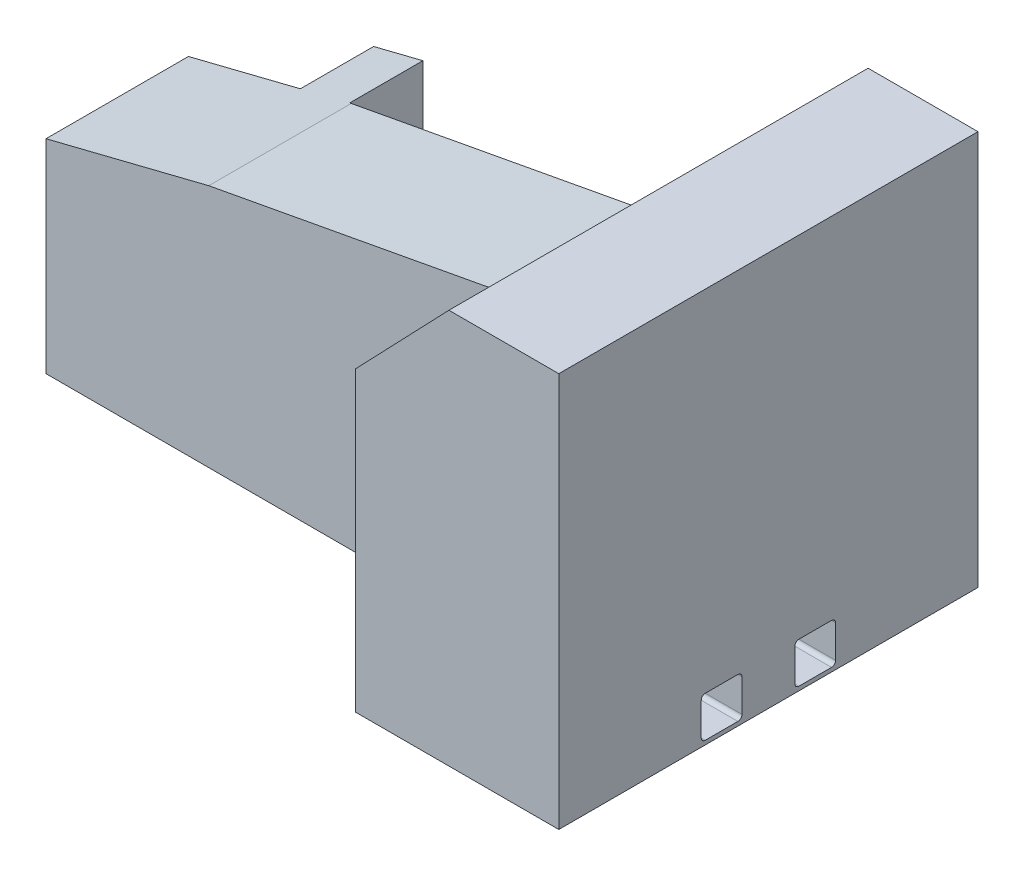
ISO-10303-21;
HEADER;
FILE_DESCRIPTION(('STEP AP214'),'2;1');
FILE_NAME('part.step','',(''),(''),'','','');
FILE_SCHEMA(('AUTOMOTIVE_DESIGN { 1 0 10303 214 1 1 1 1 }'));
ENDSEC;
DATA;
#1=APPLICATION_CONTEXT('core data for automotive mechanical design processes');
#2=APPLICATION_PROTOCOL_DEFINITION('international standard','automotive_design',2000,#1);
#3=PRODUCT_CONTEXT('',#1,'mechanical');
#4=PRODUCT('Part','Part','',(#3));
#5=PRODUCT_RELATED_PRODUCT_CATEGORY('part','',(#4));
#6=PRODUCT_DEFINITION_FORMATION('','',#4);
#7=PRODUCT_DEFINITION_CONTEXT('part definition',#1,'design');
#8=PRODUCT_DEFINITION('design','',#6,#7);
#9=PRODUCT_DEFINITION_SHAPE('','',#8);
#10=(LENGTH_UNIT() NAMED_UNIT(*) SI_UNIT(.MILLI.,.METRE.));
#11=(NAMED_UNIT(*) PLANE_ANGLE_UNIT() SI_UNIT($,.RADIAN.));
#12=(NAMED_UNIT(*) SI_UNIT($,.STERADIAN.) SOLID_ANGLE_UNIT());
#13=UNCERTAINTY_MEASURE_WITH_UNIT(LENGTH_MEASURE(1.E-05),#10,'distance_accuracy_value','');
#14=(GEOMETRIC_REPRESENTATION_CONTEXT(3) GLOBAL_UNCERTAINTY_ASSIGNED_CONTEXT((#13)) GLOBAL_UNIT_ASSIGNED_CONTEXT((#10,
#11,#12)) REPRESENTATION_CONTEXT('',''));
#15=CARTESIAN_POINT('',(0.,0.,0.));
#16=DIRECTION('',(0.,0.,1.));
#17=DIRECTION('',(1.,0.,0.));
#18=AXIS2_PLACEMENT_3D('',#15,#16,#17);
#19=CARTESIAN_POINT('',(-800.,970.,0.));
#20=DIRECTION('',(-1.,0.,0.));
#21=DIRECTION('',(0.,0.,1.));
#22=AXIS2_PLACEMENT_3D('',#19,#20,#21);
#23=PLANE('',#22);
#24=DIRECTION('',(0.,0.,1.));
#25=VECTOR('',#24,1.);
#26=CARTESIAN_POINT('',(-800.,500.,-515.));
#27=LINE('',#26,#25);
#28=CARTESIAN_POINT('',(-800.,500.,-175.));
#29=VERTEX_POINT('',#28);
#30=CARTESIAN_POINT('',(-800.,500.,175.));
#31=VERTEX_POINT('',#30);
#32=EDGE_CURVE('E336',#29,#31,#27,.T.);
#33=ORIENTED_EDGE('',*,*,#32,.F.);
#34=DIRECTION('',(0.,-1.,0.));
#35=VECTOR('',#34,1.);
#36=CARTESIAN_POINT('',(-800.,970.,-175.));
#37=LINE('',#36,#35);
#38=CARTESIAN_POINT('',(-800.,0.,-175.));
#39=VERTEX_POINT('',#38);
#40=EDGE_CURVE('E418',#29,#39,#37,.T.);
#41=ORIENTED_EDGE('',*,*,#40,.T.);
#42=DIRECTION('',(0.,0.,-1.));
#43=VECTOR('',#42,1.);
#44=CARTESIAN_POINT('',(-800.,0.,0.));
#45=LINE('',#44,#43);
#46=CARTESIAN_POINT('',(-800.,0.,175.));
#47=VERTEX_POINT('',#46);
#48=EDGE_CURVE('E395',#47,#39,#45,.T.);
#49=ORIENTED_EDGE('',*,*,#48,.F.);
#50=DIRECTION('',(0.,-1.,0.));
#51=VECTOR('',#50,1.);
#52=CARTESIAN_POINT('',(-800.,970.,175.));
#53=LINE('',#52,#51);
#54=EDGE_CURVE('E416',#31,#47,#53,.T.);
#55=ORIENTED_EDGE('',*,*,#54,.F.);
#56=EDGE_LOOP('',(#33,#41,#49,#55));
#57=FACE_BOUND('',#56,.T.);
#58=CARTESIAN_POINT('',(-800.,100.,75.));
#59=DIRECTION('',(-1.,0.,0.));
#60=DIRECTION('',(0.,0.,1.));
#61=AXIS2_PLACEMENT_3D('',#58,#59,#60);
#62=CIRCLE('',#61,9.99999999999999);
#63=CARTESIAN_POINT('',(-800.,110.,75.));
#64=VERTEX_POINT('',#63);
#65=CARTESIAN_POINT('',(-800.,99.9999999999999,65.));
#66=VERTEX_POINT('',#65);
#67=EDGE_CURVE('E295',#64,#66,#62,.T.);
#68=ORIENTED_EDGE('',*,*,#67,.F.);
#69=DIRECTION('',(0.,0.,1.));
#70=VECTOR('',#69,1.);
#71=CARTESIAN_POINT('',(-800.,110.,0.));
#72=LINE('',#71,#70);
#73=CARTESIAN_POINT('',(-800.,110.,155.));
#74=VERTEX_POINT('',#73);
#75=EDGE_CURVE('E68',#64,#74,#72,.T.);
#76=ORIENTED_EDGE('',*,*,#75,.T.);
#77=CARTESIAN_POINT('',(-800.,100.,155.));
#78=DIRECTION('',(-1.,0.,0.));
#79=DIRECTION('',(0.,0.,1.));
#80=AXIS2_PLACEMENT_3D('',#77,#78,#79);
#81=CIRCLE('',#80,10.);
#82=CARTESIAN_POINT('',(-800.,99.9999999999999,165.));
#83=VERTEX_POINT('',#82);
#84=EDGE_CURVE('E313',#74,#83,#81,.F.);
#85=ORIENTED_EDGE('',*,*,#84,.T.);
#86=DIRECTION('',(0.,-1.,0.));
#87=VECTOR('',#86,1.);
#88=CARTESIAN_POINT('',(-800.,0.,165.));
#89=LINE('',#88,#87);
#90=CARTESIAN_POINT('',(-800.,20.0000000000001,165.));
#91=VERTEX_POINT('',#90);
#92=EDGE_CURVE('E310',#83,#91,#89,.T.);
#93=ORIENTED_EDGE('',*,*,#92,.T.);
#94=CARTESIAN_POINT('',(-800.,20.,155.));
#95=DIRECTION('',(-1.,0.,0.));
#96=DIRECTION('',(0.,0.,1.));
#97=AXIS2_PLACEMENT_3D('',#94,#95,#96);
#98=CIRCLE('',#97,10.);
#99=CARTESIAN_POINT('',(-800.,10.,155.));
#100=VERTEX_POINT('',#99);
#101=EDGE_CURVE('E307',#100,#91,#98,.T.);
#102=ORIENTED_EDGE('',*,*,#101,.F.);
#103=DIRECTION('',(0.,0.,-1.));
#104=VECTOR('',#103,1.);
#105=CARTESIAN_POINT('',(-800.,10.,0.));
#106=LINE('',#105,#104);
#107=CARTESIAN_POINT('',(-800.,10.,75.));
#108=VERTEX_POINT('',#107);
#109=EDGE_CURVE('E304',#100,#108,#106,.T.);
#110=ORIENTED_EDGE('',*,*,#109,.T.);
#111=CARTESIAN_POINT('',(-800.,20.,75.));
#112=DIRECTION('',(-1.,0.,0.));
#113=DIRECTION('',(0.,0.,1.));
#114=AXIS2_PLACEMENT_3D('',#111,#112,#113);
#115=CIRCLE('',#114,10.);
#116=CARTESIAN_POINT('',(-800.,20.0000000000001,65.));
#117=VERTEX_POINT('',#116);
#118=EDGE_CURVE('E301',#117,#108,#115,.T.);
#119=ORIENTED_EDGE('',*,*,#118,.F.);
#120=DIRECTION('',(0.,1.,0.));
#121=VECTOR('',#120,1.);
#122=CARTESIAN_POINT('',(-800.,0.,65.));
#123=LINE('',#122,#121);
#124=EDGE_CURVE('E298',#117,#66,#123,.T.);
#125=ORIENTED_EDGE('',*,*,#124,.T.);
#126=EDGE_LOOP('',(#68,#76,#85,#93,#102,#110,#119,#125));
#127=FACE_BOUND('',#126,.T.);
#128=DIRECTION('',(0.,-1.,0.));
#129=VECTOR('',#128,1.);
#130=CARTESIAN_POINT('',(-800.,0.,-165.));
#131=LINE('',#130,#129);
#132=CARTESIAN_POINT('',(-800.,100.,-165.));
#133=VERTEX_POINT('',#132);
#134=CARTESIAN_POINT('',(-800.,20.0000000000001,-165.));
#135=VERTEX_POINT('',#134);
#136=EDGE_CURVE('E258',#133,#135,#131,.T.);
#137=ORIENTED_EDGE('',*,*,#136,.F.);
#138=CARTESIAN_POINT('',(-800.,100.,-155.));
#139=DIRECTION('',(-1.,0.,0.));
#140=DIRECTION('',(0.,0.,1.));
#141=AXIS2_PLACEMENT_3D('',#138,#139,#140);
#142=CIRCLE('',#141,10.);
#143=CARTESIAN_POINT('',(-800.,110.,-155.));
#144=VERTEX_POINT('',#143);
#145=EDGE_CURVE('E60',#133,#144,#142,.F.);
#146=ORIENTED_EDGE('',*,*,#145,.T.);
#147=DIRECTION('',(0.,0.,-1.));
#148=VECTOR('',#147,1.);
#149=CARTESIAN_POINT('',(-800.,110.,0.));
#150=LINE('',#149,#148);
#151=CARTESIAN_POINT('',(-800.,110.,-75.));
#152=VERTEX_POINT('',#151);
#153=EDGE_CURVE('E278',#152,#144,#150,.T.);
#154=ORIENTED_EDGE('',*,*,#153,.F.);
#155=CARTESIAN_POINT('',(-800.,100.,-75.));
#156=DIRECTION('',(-1.,0.,0.));
#157=DIRECTION('',(0.,0.,1.));
#158=AXIS2_PLACEMENT_3D('',#155,#156,#157);
#159=CIRCLE('',#158,9.99999999999999);
#160=CARTESIAN_POINT('',(-800.,99.9999999999999,-65.));
#161=VERTEX_POINT('',#160);
#162=EDGE_CURVE('E275',#161,#152,#159,.T.);
#163=ORIENTED_EDGE('',*,*,#162,.F.);
#164=DIRECTION('',(0.,1.,0.));
#165=VECTOR('',#164,1.);
#166=CARTESIAN_POINT('',(-800.,0.,-65.));
#167=LINE('',#166,#165);
#168=CARTESIAN_POINT('',(-800.,20.0000000000001,-65.));
#169=VERTEX_POINT('',#168);
#170=EDGE_CURVE('E272',#169,#161,#167,.T.);
#171=ORIENTED_EDGE('',*,*,#170,.F.);
#172=CARTESIAN_POINT('',(-800.,20.,-75.));
#173=DIRECTION('',(-1.,0.,0.));
#174=DIRECTION('',(0.,0.,1.));
#175=AXIS2_PLACEMENT_3D('',#172,#173,#174);
#176=CIRCLE('',#175,10.);
#177=CARTESIAN_POINT('',(-800.,10.,-75.));
#178=VERTEX_POINT('',#177);
#179=EDGE_CURVE('E266',#178,#169,#176,.T.);
#180=ORIENTED_EDGE('',*,*,#179,.F.);
#181=DIRECTION('',(0.,0.,1.));
#182=VECTOR('',#181,1.);
#183=CARTESIAN_POINT('',(-800.,10.,0.));
#184=LINE('',#183,#182);
#185=CARTESIAN_POINT('',(-800.,10.,-155.));
#186=VERTEX_POINT('',#185);
#187=EDGE_CURVE('E264',#186,#178,#184,.T.);
#188=ORIENTED_EDGE('',*,*,#187,.F.);
#189=CARTESIAN_POINT('',(-800.,20.,-155.));
#190=DIRECTION('',(-1.,0.,0.));
#191=DIRECTION('',(0.,0.,1.));
#192=AXIS2_PLACEMENT_3D('',#189,#190,#191);
#193=CIRCLE('',#192,10.);
#194=EDGE_CURVE('E248',#135,#186,#193,.T.);
#195=ORIENTED_EDGE('',*,*,#194,.F.);
#196=EDGE_LOOP('',(#137,#146,#154,#163,#171,#180,#188,#195));
#197=FACE_BOUND('',#196,.T.);
#198=ADVANCED_FACE('F43',(#57,#127,#197),#23,.T.);
#199=CARTESIAN_POINT('',(800.,970.,0.));
#200=DIRECTION('',(-1.,0.,0.));
#201=DIRECTION('',(0.,0.,1.));
#202=AXIS2_PLACEMENT_3D('',#199,#200,#201);
#203=PLANE('',#202);
#204=DIRECTION('',(0.,0.,1.));
#205=VECTOR('',#204,1.);
#206=CARTESIAN_POINT('',(800.,110.,0.));
#207=LINE('',#206,#205);
#208=CARTESIAN_POINT('',(800.,110.,75.));
#209=VERTEX_POINT('',#208);
#210=CARTESIAN_POINT('',(800.,110.,155.));
#211=VERTEX_POINT('',#210);
#212=EDGE_CURVE('E452',#209,#211,#207,.T.);
#213=ORIENTED_EDGE('',*,*,#212,.F.);
#214=CARTESIAN_POINT('',(800.,100.,75.));
#215=DIRECTION('',(-1.,0.,0.));
#216=DIRECTION('',(0.,0.,1.));
#217=AXIS2_PLACEMENT_3D('',#214,#215,#216);
#218=CIRCLE('',#217,9.99999999999999);
#219=CARTESIAN_POINT('',(800.,99.9999999999999,65.));
#220=VERTEX_POINT('',#219);
#221=EDGE_CURVE('E434',#209,#220,#218,.T.);
#222=ORIENTED_EDGE('',*,*,#221,.T.);
#223=DIRECTION('',(0.,1.,0.));
#224=VECTOR('',#223,1.);
#225=CARTESIAN_POINT('',(800.,970.,65.));
#226=LINE('',#225,#224);
#227=CARTESIAN_POINT('',(800.,20.0000000000001,65.));
#228=VERTEX_POINT('',#227);
#229=EDGE_CURVE('E437',#228,#220,#226,.T.);
#230=ORIENTED_EDGE('',*,*,#229,.F.);
#231=CARTESIAN_POINT('',(800.,20.,75.));
#232=DIRECTION('',(-1.,0.,0.));
#233=DIRECTION('',(0.,0.,1.));
#234=AXIS2_PLACEMENT_3D('',#231,#232,#233);
#235=CIRCLE('',#234,10.);
#236=CARTESIAN_POINT('',(800.,10.,75.));
#237=VERTEX_POINT('',#236);
#238=EDGE_CURVE('E440',#228,#237,#235,.T.);
#239=ORIENTED_EDGE('',*,*,#238,.T.);
#240=DIRECTION('',(0.,0.,-1.));
#241=VECTOR('',#240,1.);
#242=CARTESIAN_POINT('',(800.,10.,-2.28983498828939E-13));
#243=LINE('',#242,#241);
#244=CARTESIAN_POINT('',(800.,10.,155.));
#245=VERTEX_POINT('',#244);
#246=EDGE_CURVE('E443',#245,#237,#243,.T.);
#247=ORIENTED_EDGE('',*,*,#246,.F.);
#248=CARTESIAN_POINT('',(800.,20.,155.));
#249=DIRECTION('',(-1.,0.,0.));
#250=DIRECTION('',(0.,0.,1.));
#251=AXIS2_PLACEMENT_3D('',#248,#249,#250);
#252=CIRCLE('',#251,10.);
#253=CARTESIAN_POINT('',(800.,20.0000000000001,165.));
#254=VERTEX_POINT('',#253);
#255=EDGE_CURVE('E445',#245,#254,#252,.T.);
#256=ORIENTED_EDGE('',*,*,#255,.T.);
#257=DIRECTION('',(0.,-1.,0.));
#258=VECTOR('',#257,1.);
#259=CARTESIAN_POINT('',(800.,970.,165.));
#260=LINE('',#259,#258);
#261=CARTESIAN_POINT('',(800.,99.9999999999999,165.));
#262=VERTEX_POINT('',#261);
#263=EDGE_CURVE('E448',#262,#254,#260,.T.);
#264=ORIENTED_EDGE('',*,*,#263,.F.);
#265=CARTESIAN_POINT('',(800.,100.,155.));
#266=DIRECTION('',(-1.,0.,0.));
#267=DIRECTION('',(0.,0.,1.));
#268=AXIS2_PLACEMENT_3D('',#265,#266,#267);
#269=CIRCLE('',#268,10.);
#270=EDGE_CURVE('E450',#211,#262,#269,.F.);
#271=ORIENTED_EDGE('',*,*,#270,.F.);
#272=EDGE_LOOP('',(#213,#222,#230,#239,#247,#256,#264,#271));
#273=FACE_BOUND('',#272,.T.);
#274=DIRECTION('',(0.,0.,-1.));
#275=VECTOR('',#274,1.);
#276=CARTESIAN_POINT('',(800.,0.,0.));
#277=LINE('',#276,#275);
#278=CARTESIAN_POINT('',(800.,0.,515.));
#279=VERTEX_POINT('',#278);
#280=CARTESIAN_POINT('',(800.,0.,-515.));
#281=VERTEX_POINT('',#280);
#282=EDGE_CURVE('E370',#279,#281,#277,.T.);
#283=ORIENTED_EDGE('',*,*,#282,.T.);
#284=DIRECTION('',(0.,-1.,0.));
#285=VECTOR('',#284,1.);
#286=CARTESIAN_POINT('',(800.,970.,-515.));
#287=LINE('',#286,#285);
#288=CARTESIAN_POINT('',(800.,970.,-515.));
#289=VERTEX_POINT('',#288);
#290=EDGE_CURVE('E376',#289,#281,#287,.T.);
#291=ORIENTED_EDGE('',*,*,#290,.F.);
#292=DIRECTION('',(0.,0.,-1.));
#293=VECTOR('',#292,1.);
#294=CARTESIAN_POINT('',(800.,970.,0.));
#295=LINE('',#294,#293);
#296=CARTESIAN_POINT('',(800.,970.,515.));
#297=VERTEX_POINT('',#296);
#298=EDGE_CURVE('E373',#297,#289,#295,.T.);
#299=ORIENTED_EDGE('',*,*,#298,.F.);
#300=DIRECTION('',(0.,-1.,0.));
#301=VECTOR('',#300,1.);
#302=CARTESIAN_POINT('',(800.,970.,515.));
#303=LINE('',#302,#301);
#304=EDGE_CURVE('E410',#297,#279,#303,.T.);
#305=ORIENTED_EDGE('',*,*,#304,.T.);
#306=EDGE_LOOP('',(#283,#291,#299,#305));
#307=FACE_BOUND('',#306,.T.);
#308=CARTESIAN_POINT('',(800.,100.,-155.));
#309=DIRECTION('',(-1.,0.,0.));
#310=DIRECTION('',(0.,0.,1.));
#311=AXIS2_PLACEMENT_3D('',#308,#309,#310);
#312=CIRCLE('',#311,10.);
#313=CARTESIAN_POINT('',(800.,99.9999999999999,-165.));
#314=VERTEX_POINT('',#313);
#315=CARTESIAN_POINT('',(800.,110.,-155.));
#316=VERTEX_POINT('',#315);
#317=EDGE_CURVE('E11',#314,#316,#312,.F.);
#318=ORIENTED_EDGE('',*,*,#317,.F.);
#319=DIRECTION('',(0.,-1.,0.));
#320=VECTOR('',#319,1.);
#321=CARTESIAN_POINT('',(800.,970.,-165.));
#322=LINE('',#321,#320);
#323=CARTESIAN_POINT('',(800.,20.0000000000001,-165.));
#324=VERTEX_POINT('',#323);
#325=EDGE_CURVE('E454',#314,#324,#322,.T.);
#326=ORIENTED_EDGE('',*,*,#325,.T.);
#327=CARTESIAN_POINT('',(800.,20.,-155.));
#328=DIRECTION('',(-1.,0.,0.));
#329=DIRECTION('',(0.,0.,1.));
#330=AXIS2_PLACEMENT_3D('',#327,#328,#329);
#331=CIRCLE('',#330,10.);
#332=CARTESIAN_POINT('',(800.,10.,-155.));
#333=VERTEX_POINT('',#332);
#334=EDGE_CURVE('E251',#324,#333,#331,.T.);
#335=ORIENTED_EDGE('',*,*,#334,.T.);
#336=DIRECTION('',(0.,0.,1.));
#337=VECTOR('',#336,1.);
#338=CARTESIAN_POINT('',(800.,10.,2.28983498828939E-13));
#339=LINE('',#338,#337);
#340=CARTESIAN_POINT('',(800.,10.,-75.));
#341=VERTEX_POINT('',#340);
#342=EDGE_CURVE('E457',#333,#341,#339,.T.);
#343=ORIENTED_EDGE('',*,*,#342,.T.);
#344=CARTESIAN_POINT('',(800.,20.,-75.));
#345=DIRECTION('',(-1.,0.,0.));
#346=DIRECTION('',(0.,0.,1.));
#347=AXIS2_PLACEMENT_3D('',#344,#345,#346);
#348=CIRCLE('',#347,10.);
#349=CARTESIAN_POINT('',(800.,20.0000000000001,-65.));
#350=VERTEX_POINT('',#349);
#351=EDGE_CURVE('E460',#341,#350,#348,.T.);
#352=ORIENTED_EDGE('',*,*,#351,.T.);
#353=DIRECTION('',(0.,1.,0.));
#354=VECTOR('',#353,1.);
#355=CARTESIAN_POINT('',(800.,970.,-65.));
#356=LINE('',#355,#354);
#357=CARTESIAN_POINT('',(800.,99.9999999999999,-65.));
#358=VERTEX_POINT('',#357);
#359=EDGE_CURVE('E463',#350,#358,#356,.T.);
#360=ORIENTED_EDGE('',*,*,#359,.T.);
#361=CARTESIAN_POINT('',(800.,100.,-75.));
#362=DIRECTION('',(-1.,0.,0.));
#363=DIRECTION('',(0.,0.,1.));
#364=AXIS2_PLACEMENT_3D('',#361,#362,#363);
#365=CIRCLE('',#364,9.99999999999999);
#366=CARTESIAN_POINT('',(800.,110.,-75.));
#367=VERTEX_POINT('',#366);
#368=EDGE_CURVE('E466',#358,#367,#365,.T.);
#369=ORIENTED_EDGE('',*,*,#368,.T.);
#370=DIRECTION('',(0.,0.,-1.));
#371=VECTOR('',#370,1.);
#372=CARTESIAN_POINT('',(800.,110.,0.));
#373=LINE('',#372,#371);
#374=EDGE_CURVE('E52',#367,#316,#373,.T.);
#375=ORIENTED_EDGE('',*,*,#374,.T.);
#376=EDGE_LOOP('',(#318,#326,#335,#343,#352,#360,#369,#375));
#377=FACE_BOUND('',#376,.T.);
#378=ADVANCED_FACE('F504',(#273,#307,#377),#203,.F.);
#379=CARTESIAN_POINT('',(0.,970.,-515.));
#380=DIRECTION('',(0.,0.,-1.));
#381=DIRECTION('',(-1.,0.,0.));
#382=AXIS2_PLACEMENT_3D('',#379,#380,#381);
#383=PLANE('',#382);
#384=DIRECTION('',(0.691905363235615,0.721988205115424,0.));
#385=VECTOR('',#384,1.);
#386=CARTESIAN_POINT('',(-208.289592760181,199.610859728507,-515.));
#387=LINE('',#386,#385);
#388=CARTESIAN_POINT('',(300.,730.,-515.));
#389=VERTEX_POINT('',#388);
#390=CARTESIAN_POINT('',(530.,970.,-515.));
#391=VERTEX_POINT('',#390);
#392=EDGE_CURVE('E333',#389,#391,#387,.T.);
#393=ORIENTED_EDGE('',*,*,#392,.T.);
#394=DIRECTION('',(1.,0.,0.));
#395=VECTOR('',#394,1.);
#396=CARTESIAN_POINT('',(0.,970.,-515.));
#397=LINE('',#396,#395);
#398=EDGE_CURVE('E367',#391,#289,#397,.T.);
#399=ORIENTED_EDGE('',*,*,#398,.T.);
#400=ORIENTED_EDGE('',*,*,#290,.T.);
#401=DIRECTION('',(1.,0.,0.));
#402=VECTOR('',#401,1.);
#403=CARTESIAN_POINT('',(0.,0.,-515.));
#404=LINE('',#403,#402);
#405=CARTESIAN_POINT('',(300.,0.,-515.));
#406=VERTEX_POINT('',#405);
#407=EDGE_CURVE('E366',#406,#281,#404,.T.);
#408=ORIENTED_EDGE('',*,*,#407,.F.);
#409=DIRECTION('',(0.,-1.,0.));
#410=VECTOR('',#409,1.);
#411=CARTESIAN_POINT('',(300.,970.,-515.));
#412=LINE('',#411,#410);
#413=EDGE_CURVE('E430',#389,#406,#412,.T.);
#414=ORIENTED_EDGE('',*,*,#413,.F.);
#415=EDGE_LOOP('',(#393,#399,#400,#408,#414));
#416=FACE_BOUND('',#415,.T.);
#417=ADVANCED_FACE('F45',(#416),#383,.T.);
#418=CARTESIAN_POINT('',(300.,970.,0.));
#419=DIRECTION('',(-1.,0.,0.));
#420=DIRECTION('',(0.,0.,1.));
#421=AXIS2_PLACEMENT_3D('',#418,#419,#420);
#422=PLANE('',#421);
#423=DIRECTION('',(0.,0.,1.));
#424=VECTOR('',#423,1.);
#425=CARTESIAN_POINT('',(300.,730.,-515.));
#426=LINE('',#425,#424);
#427=CARTESIAN_POINT('',(300.,730.,-175.));
#428=VERTEX_POINT('',#427);
#429=EDGE_CURVE('E341',#389,#428,#426,.T.);
#430=ORIENTED_EDGE('',*,*,#429,.F.);
#431=ORIENTED_EDGE('',*,*,#413,.T.);
#432=DIRECTION('',(0.,0.,-1.));
#433=VECTOR('',#432,1.);
#434=CARTESIAN_POINT('',(300.,0.,0.));
#435=LINE('',#434,#433);
#436=CARTESIAN_POINT('',(300.,0.,-175.));
#437=VERTEX_POINT('',#436);
#438=EDGE_CURVE('E379',#437,#406,#435,.T.);
#439=ORIENTED_EDGE('',*,*,#438,.F.);
#440=DIRECTION('',(0.,-1.,0.));
#441=VECTOR('',#440,1.);
#442=CARTESIAN_POINT('',(300.,970.,-175.));
#443=LINE('',#442,#441);
#444=EDGE_CURVE('E428',#428,#437,#443,.T.);
#445=ORIENTED_EDGE('',*,*,#444,.F.);
#446=EDGE_LOOP('',(#430,#431,#439,#445));
#447=FACE_BOUND('',#446,.T.);
#448=ADVANCED_FACE('F567',(#447),#422,.T.);
#449=CARTESIAN_POINT('',(0.,970.,-175.));
#450=DIRECTION('',(0.,0.,-1.));
#451=DIRECTION('',(-1.,0.,0.));
#452=AXIS2_PLACEMENT_3D('',#449,#450,#451);
#453=PLANE('',#452);
#454=DIRECTION('',(-0.983188736076488,-0.182592193842776,0.));
#455=VECTOR('',#454,1.);
#456=CARTESIAN_POINT('',(53.0873939633064,684.144801736042,-175.));
#457=LINE('',#456,#455);
#458=CARTESIAN_POINT('',(-400.,600.,-175.));
#459=VERTEX_POINT('',#458);
#460=EDGE_CURVE('E351',#428,#459,#457,.T.);
#461=ORIENTED_EDGE('',*,*,#460,.F.);
#462=ORIENTED_EDGE('',*,*,#444,.T.);
#463=DIRECTION('',(1.,0.,0.));
#464=VECTOR('',#463,1.);
#465=CARTESIAN_POINT('',(0.,0.,-175.));
#466=LINE('',#465,#464);
#467=CARTESIAN_POINT('',(-404.,0.,-175.));
#468=VERTEX_POINT('',#467);
#469=EDGE_CURVE('E382',#468,#437,#466,.T.);
#470=ORIENTED_EDGE('',*,*,#469,.F.);
#471=DIRECTION('',(0.,-1.,0.));
#472=VECTOR('',#471,1.);
#473=CARTESIAN_POINT('',(-404.,970.,-175.));
#474=LINE('',#473,#472);
#475=CARTESIAN_POINT('',(-404.,599.,-175.));
#476=VERTEX_POINT('',#475);
#477=EDGE_CURVE('E426',#476,#468,#474,.T.);
#478=ORIENTED_EDGE('',*,*,#477,.F.);
#479=DIRECTION('',(-0.970142500145332,-0.242535625036333,0.));
#480=VECTOR('',#479,1.);
#481=CARTESIAN_POINT('',(63.5294117647059,715.882352941176,-175.));
#482=LINE('',#481,#480);
#483=EDGE_CURVE('E364',#459,#476,#482,.T.);
#484=ORIENTED_EDGE('',*,*,#483,.F.);
#485=EDGE_LOOP('',(#461,#462,#470,#478,#484));
#486=FACE_BOUND('',#485,.T.);
#487=ADVANCED_FACE('F556',(#486),#453,.T.);
#488=CARTESIAN_POINT('',(-404.,970.,0.));
#489=DIRECTION('',(-1.,0.,0.));
#490=DIRECTION('',(0.,0.,1.));
#491=AXIS2_PLACEMENT_3D('',#488,#489,#490);
#492=PLANE('',#491);
#493=DIRECTION('',(0.,-1.,0.));
#494=VECTOR('',#493,1.);
#495=CARTESIAN_POINT('',(-404.,970.,-355.));
#496=LINE('',#495,#494);
#497=CARTESIAN_POINT('',(-404.,599.,-355.));
#498=VERTEX_POINT('',#497);
#499=CARTESIAN_POINT('',(-404.,0.,-355.));
#500=VERTEX_POINT('',#499);
#501=EDGE_CURVE('E424',#498,#500,#496,.T.);
#502=ORIENTED_EDGE('',*,*,#501,.F.);
#503=DIRECTION('',(0.,0.,1.));
#504=VECTOR('',#503,1.);
#505=CARTESIAN_POINT('',(-404.,599.,0.));
#506=LINE('',#505,#504);
#507=EDGE_CURVE('E361',#498,#476,#506,.T.);
#508=ORIENTED_EDGE('',*,*,#507,.T.);
#509=ORIENTED_EDGE('',*,*,#477,.T.);
#510=DIRECTION('',(0.,0.,-1.));
#511=VECTOR('',#510,1.);
#512=CARTESIAN_POINT('',(-404.,0.,0.));
#513=LINE('',#512,#511);
#514=EDGE_CURVE('E385',#468,#500,#513,.T.);
#515=ORIENTED_EDGE('',*,*,#514,.T.);
#516=EDGE_LOOP('',(#502,#508,#509,#515));
#517=FACE_BOUND('',#516,.T.);
#518=ADVANCED_FACE('F563',(#517),#492,.F.);
#519=CARTESIAN_POINT('',(0.,970.,-355.));
#520=DIRECTION('',(0.,0.,1.));
#521=DIRECTION('',(1.,0.,0.));
#522=AXIS2_PLACEMENT_3D('',#519,#520,#521);
#523=PLANE('',#522);
#524=DIRECTION('',(0.,-1.,0.));
#525=VECTOR('',#524,1.);
#526=CARTESIAN_POINT('',(-525.,970.,-355.));
#527=LINE('',#526,#525);
#528=CARTESIAN_POINT('',(-525.,568.75,-355.));
#529=VERTEX_POINT('',#528);
#530=CARTESIAN_POINT('',(-525.,0.,-355.));
#531=VERTEX_POINT('',#530);
#532=EDGE_CURVE('E422',#529,#531,#527,.T.);
#533=ORIENTED_EDGE('',*,*,#532,.F.);
#534=DIRECTION('',(0.970142500145332,0.242535625036333,0.));
#535=VECTOR('',#534,1.);
#536=CARTESIAN_POINT('',(63.5294117647059,715.882352941176,-355.));
#537=LINE('',#536,#535);
#538=EDGE_CURVE('E358',#529,#498,#537,.T.);
#539=ORIENTED_EDGE('',*,*,#538,.T.);
#540=ORIENTED_EDGE('',*,*,#501,.T.);
#541=DIRECTION('',(-1.,0.,0.));
#542=VECTOR('',#541,1.);
#543=CARTESIAN_POINT('',(0.,0.,-355.));
#544=LINE('',#543,#542);
#545=EDGE_CURVE('E389',#500,#531,#544,.T.);
#546=ORIENTED_EDGE('',*,*,#545,.T.);
#547=EDGE_LOOP('',(#533,#539,#540,#546));
#548=FACE_BOUND('',#547,.T.);
#549=ADVANCED_FACE('F559',(#548),#523,.F.);
#550=CARTESIAN_POINT('',(-525.,970.,0.));
#551=DIRECTION('',(1.,0.,0.));
#552=DIRECTION('',(0.,0.,-1.));
#553=AXIS2_PLACEMENT_3D('',#550,#551,#552);
#554=PLANE('',#553);
#555=DIRECTION('',(0.,-1.,0.));
#556=VECTOR('',#555,1.);
#557=CARTESIAN_POINT('',(-525.,970.,-175.));
#558=LINE('',#557,#556);
#559=CARTESIAN_POINT('',(-525.,568.75,-175.));
#560=VERTEX_POINT('',#559);
#561=CARTESIAN_POINT('',(-525.,0.,-175.));
#562=VERTEX_POINT('',#561);
#563=EDGE_CURVE('E420',#560,#562,#558,.T.);
#564=ORIENTED_EDGE('',*,*,#563,.F.);
#565=DIRECTION('',(0.,0.,-1.));
#566=VECTOR('',#565,1.);
#567=CARTESIAN_POINT('',(-525.,568.75,0.));
#568=LINE('',#567,#566);
#569=EDGE_CURVE('E355',#560,#529,#568,.T.);
#570=ORIENTED_EDGE('',*,*,#569,.T.);
#571=ORIENTED_EDGE('',*,*,#532,.T.);
#572=DIRECTION('',(0.,0.,1.));
#573=VECTOR('',#572,1.);
#574=CARTESIAN_POINT('',(-525.,0.,0.));
#575=LINE('',#574,#573);
#576=EDGE_CURVE('E392',#531,#562,#575,.T.);
#577=ORIENTED_EDGE('',*,*,#576,.T.);
#578=EDGE_LOOP('',(#564,#570,#571,#577));
#579=FACE_BOUND('',#578,.T.);
#580=ADVANCED_FACE('F554',(#579),#554,.F.);
#581=DIRECTION('',(-0.970142500145332,-0.242535625036333,0.));
#582=VECTOR('',#581,1.);
#583=CARTESIAN_POINT('',(63.5294117647059,715.882352941176,-175.));
#584=LINE('',#583,#582);
#585=EDGE_CURVE('E353',#560,#29,#584,.T.);
#586=ORIENTED_EDGE('',*,*,#585,.F.);
#587=ORIENTED_EDGE('',*,*,#563,.T.);
#588=EDGE_CURVE('E386',#39,#562,#466,.T.);
#589=ORIENTED_EDGE('',*,*,#588,.F.);
#590=ORIENTED_EDGE('',*,*,#40,.F.);
#591=EDGE_LOOP('',(#586,#587,#589,#590));
#592=FACE_BOUND('',#591,.T.);
#593=ADVANCED_FACE('F551',(#592),#453,.T.);
#594=CARTESIAN_POINT('',(0.,970.,175.));
#595=DIRECTION('',(0.,0.,1.));
#596=DIRECTION('',(1.,0.,0.));
#597=AXIS2_PLACEMENT_3D('',#594,#595,#596);
#598=PLANE('',#597);
#599=DIRECTION('',(0.983188736076488,0.182592193842776,0.));
#600=VECTOR('',#599,1.);
#601=CARTESIAN_POINT('',(53.0873939633064,684.144801736042,175.));
#602=LINE('',#601,#600);
#603=CARTESIAN_POINT('',(-400.,600.,175.));
#604=VERTEX_POINT('',#603);
#605=CARTESIAN_POINT('',(300.,730.,175.));
#606=VERTEX_POINT('',#605);
#607=EDGE_CURVE('E340',#604,#606,#602,.T.);
#608=ORIENTED_EDGE('',*,*,#607,.F.);
#609=DIRECTION('',(0.970142500145332,0.242535625036333,0.));
#610=VECTOR('',#609,1.);
#611=CARTESIAN_POINT('',(63.5294117647059,715.882352941176,175.));
#612=LINE('',#611,#610);
#613=EDGE_CURVE('E432',#31,#604,#612,.T.);
#614=ORIENTED_EDGE('',*,*,#613,.F.);
#615=ORIENTED_EDGE('',*,*,#54,.T.);
#616=DIRECTION('',(-1.,0.,0.));
#617=VECTOR('',#616,1.);
#618=CARTESIAN_POINT('',(0.,0.,175.));
#619=LINE('',#618,#617);
#620=CARTESIAN_POINT('',(300.,0.,175.));
#621=VERTEX_POINT('',#620);
#622=EDGE_CURVE('E398',#621,#47,#619,.T.);
#623=ORIENTED_EDGE('',*,*,#622,.F.);
#624=DIRECTION('',(0.,-1.,0.));
#625=VECTOR('',#624,1.);
#626=CARTESIAN_POINT('',(300.,970.,175.));
#627=LINE('',#626,#625);
#628=EDGE_CURVE('E414',#606,#621,#627,.T.);
#629=ORIENTED_EDGE('',*,*,#628,.F.);
#630=EDGE_LOOP('',(#608,#614,#615,#623,#629));
#631=FACE_BOUND('',#630,.T.);
#632=ADVANCED_FACE('F549',(#631),#598,.T.);
#633=CARTESIAN_POINT('',(300.,970.,0.));
#634=DIRECTION('',(-1.,0.,0.));
#635=DIRECTION('',(0.,0.,1.));
#636=AXIS2_PLACEMENT_3D('',#633,#634,#635);
#637=PLANE('',#636);
#638=CARTESIAN_POINT('',(300.,730.,515.));
#639=VERTEX_POINT('',#638);
#640=EDGE_CURVE('E345',#606,#639,#426,.T.);
#641=ORIENTED_EDGE('',*,*,#640,.F.);
#642=ORIENTED_EDGE('',*,*,#628,.T.);
#643=DIRECTION('',(0.,0.,-1.));
#644=VECTOR('',#643,1.);
#645=CARTESIAN_POINT('',(300.,0.,0.));
#646=LINE('',#645,#644);
#647=CARTESIAN_POINT('',(300.,0.,515.));
#648=VERTEX_POINT('',#647);
#649=EDGE_CURVE('E401',#648,#621,#646,.T.);
#650=ORIENTED_EDGE('',*,*,#649,.F.);
#651=DIRECTION('',(0.,-1.,0.));
#652=VECTOR('',#651,1.);
#653=CARTESIAN_POINT('',(300.,970.,515.));
#654=LINE('',#653,#652);
#655=EDGE_CURVE('E412',#639,#648,#654,.T.);
#656=ORIENTED_EDGE('',*,*,#655,.F.);
#657=EDGE_LOOP('',(#641,#642,#650,#656));
#658=FACE_BOUND('',#657,.T.);
#659=ADVANCED_FACE('F612',(#658),#637,.T.);
#660=CARTESIAN_POINT('',(1.14352971536391E-13,970.,515.));
#661=DIRECTION('',(0.,0.,1.));
#662=DIRECTION('',(1.,0.,0.));
#663=AXIS2_PLACEMENT_3D('',#660,#661,#662);
#664=PLANE('',#663);
#665=DIRECTION('',(0.691905363235615,0.721988205115424,0.));
#666=VECTOR('',#665,1.);
#667=CARTESIAN_POINT('',(-208.289592760181,199.610859728507,515.));
#668=LINE('',#667,#666);
#669=CARTESIAN_POINT('',(530.,970.,515.));
#670=VERTEX_POINT('',#669);
#671=EDGE_CURVE('E283',#639,#670,#668,.T.);
#672=ORIENTED_EDGE('',*,*,#671,.F.);
#673=ORIENTED_EDGE('',*,*,#655,.T.);
#674=DIRECTION('',(-1.,0.,0.));
#675=VECTOR('',#674,1.);
#676=CARTESIAN_POINT('',(1.14352971536391E-13,0.,515.));
#677=LINE('',#676,#675);
#678=EDGE_CURVE('E404',#279,#648,#677,.T.);
#679=ORIENTED_EDGE('',*,*,#678,.F.);
#680=ORIENTED_EDGE('',*,*,#304,.F.);
#681=DIRECTION('',(-1.,0.,0.));
#682=VECTOR('',#681,1.);
#683=CARTESIAN_POINT('',(1.14352971536391E-13,970.,515.));
#684=LINE('',#683,#682);
#685=EDGE_CURVE('E369',#297,#670,#684,.T.);
#686=ORIENTED_EDGE('',*,*,#685,.T.);
#687=EDGE_LOOP('',(#672,#673,#679,#680,#686));
#688=FACE_BOUND('',#687,.T.);
#689=ADVANCED_FACE('F629',(#688),#664,.T.);
#690=CARTESIAN_POINT('',(0.,970.,0.));
#691=DIRECTION('',(0.,1.,0.));
#692=DIRECTION('',(0.,0.,1.));
#693=AXIS2_PLACEMENT_3D('',#690,#691,#692);
#694=PLANE('',#693);
#695=DIRECTION('',(0.,0.,1.));
#696=VECTOR('',#695,1.);
#697=CARTESIAN_POINT('',(530.,970.,-515.));
#698=LINE('',#697,#696);
#699=EDGE_CURVE('E337',#391,#670,#698,.T.);
#700=ORIENTED_EDGE('',*,*,#699,.T.);
#701=ORIENTED_EDGE('',*,*,#685,.F.);
#702=ORIENTED_EDGE('',*,*,#298,.T.);
#703=ORIENTED_EDGE('',*,*,#398,.F.);
#704=EDGE_LOOP('',(#700,#701,#702,#703));
#705=FACE_BOUND('',#704,.T.);
#706=ADVANCED_FACE('F624',(#705),#694,.T.);
#707=CARTESIAN_POINT('',(0.,0.,0.));
#708=DIRECTION('',(0.,1.,0.));
#709=DIRECTION('',(0.,0.,1.));
#710=AXIS2_PLACEMENT_3D('',#707,#708,#709);
#711=PLANE('',#710);
#712=CARTESIAN_POINT('',(498.5,0.,115.));
#713=DIRECTION('',(0.,-1.,0.));
#714=DIRECTION('',(0.,0.,1.));
#715=AXIS2_PLACEMENT_3D('',#712,#713,#714);
#716=CIRCLE('',#715,8.4999999999999);
#717=CARTESIAN_POINT('',(498.5,0.,123.5));
#718=VERTEX_POINT('',#717);
#719=EDGE_CURVE('E904',#718,#718,#716,.T.);
#720=ORIENTED_EDGE('',*,*,#719,.F.);
#721=EDGE_LOOP('',(#720));
#722=FACE_BOUND('',#721,.T.);
#723=CARTESIAN_POINT('',(501.,0.,-115.));
#724=DIRECTION('',(0.,-1.,0.));
#725=DIRECTION('',(0.,0.,1.));
#726=AXIS2_PLACEMENT_3D('',#723,#724,#725);
#727=CIRCLE('',#726,8.50000000000001);
#728=CARTESIAN_POINT('',(501.,0.,-106.5));
#729=VERTEX_POINT('',#728);
#730=EDGE_CURVE('E901',#729,#729,#727,.T.);
#731=ORIENTED_EDGE('',*,*,#730,.F.);
#732=EDGE_LOOP('',(#731));
#733=FACE_BOUND('',#732,.T.);
#734=CARTESIAN_POINT('',(-501.,0.,-115.));
#735=DIRECTION('',(0.,-1.,0.));
#736=DIRECTION('',(0.,0.,-1.));
#737=AXIS2_PLACEMENT_3D('',#734,#735,#736);
#738=CIRCLE('',#737,8.50000000000001);
#739=CARTESIAN_POINT('',(-501.,0.,-123.5));
#740=VERTEX_POINT('',#739);
#741=EDGE_CURVE('E898',#740,#740,#738,.T.);
#742=ORIENTED_EDGE('',*,*,#741,.F.);
#743=EDGE_LOOP('',(#742));
#744=FACE_BOUND('',#743,.T.);
#745=CARTESIAN_POINT('',(-498.5,0.,115.));
#746=DIRECTION('',(0.,-1.,0.));
#747=DIRECTION('',(0.,0.,-1.));
#748=AXIS2_PLACEMENT_3D('',#745,#746,#747);
#749=CIRCLE('',#748,8.4999999999999);
#750=CARTESIAN_POINT('',(-498.5,0.,106.5));
#751=VERTEX_POINT('',#750);
#752=EDGE_CURVE('E475',#751,#751,#749,.T.);
#753=ORIENTED_EDGE('',*,*,#752,.F.);
#754=EDGE_LOOP('',(#753));
#755=FACE_BOUND('',#754,.T.);
#756=ORIENTED_EDGE('',*,*,#407,.T.);
#757=ORIENTED_EDGE('',*,*,#282,.F.);
#758=ORIENTED_EDGE('',*,*,#678,.T.);
#759=ORIENTED_EDGE('',*,*,#649,.T.);
#760=ORIENTED_EDGE('',*,*,#622,.T.);
#761=ORIENTED_EDGE('',*,*,#48,.T.);
#762=ORIENTED_EDGE('',*,*,#588,.T.);
#763=ORIENTED_EDGE('',*,*,#576,.F.);
#764=ORIENTED_EDGE('',*,*,#545,.F.);
#765=ORIENTED_EDGE('',*,*,#514,.F.);
#766=ORIENTED_EDGE('',*,*,#469,.T.);
#767=ORIENTED_EDGE('',*,*,#438,.T.);
#768=EDGE_LOOP('',(#756,#757,#758,#759,#760,#761,#762,#763,#764,#765,#766,#767));
#769=FACE_BOUND('',#768,.T.);
#770=ADVANCED_FACE('F588',(#722,#733,#744,#755,#769),#711,.F.);
#771=CARTESIAN_POINT('',(-208.289592760181,199.610859728507,-515.));
#772=DIRECTION('',(0.721988205115424,-0.691905363235615,0.));
#773=DIRECTION('',(0.691905363235615,0.721988205115424,0.));
#774=AXIS2_PLACEMENT_3D('',#771,#772,#773);
#775=PLANE('',#774);
#776=ORIENTED_EDGE('',*,*,#699,.F.);
#777=ORIENTED_EDGE('',*,*,#392,.F.);
#778=ORIENTED_EDGE('',*,*,#429,.T.);
#779=EDGE_CURVE('E344',#428,#606,#426,.T.);
#780=ORIENTED_EDGE('',*,*,#779,.T.);
#781=ORIENTED_EDGE('',*,*,#640,.T.);
#782=ORIENTED_EDGE('',*,*,#671,.T.);
#783=EDGE_LOOP('',(#776,#777,#778,#780,#781,#782));
#784=FACE_BOUND('',#783,.T.);
#785=ADVANCED_FACE('F615',(#784),#775,.F.);
#786=CARTESIAN_POINT('',(-121.049516669955,651.805089761294,-515.));
#787=DIRECTION('',(0.182592193842776,-0.983188736076488,0.));
#788=DIRECTION('',(0.983188736076488,0.182592193842776,0.));
#789=AXIS2_PLACEMENT_3D('',#786,#787,#788);
#790=PLANE('',#789);
#791=ORIENTED_EDGE('',*,*,#460,.T.);
#792=DIRECTION('',(0.,0.,1.));
#793=VECTOR('',#792,1.);
#794=CARTESIAN_POINT('',(-400.,600.,-515.));
#795=LINE('',#794,#793);
#796=EDGE_CURVE('E346',#459,#604,#795,.T.);
#797=ORIENTED_EDGE('',*,*,#796,.T.);
#798=ORIENTED_EDGE('',*,*,#607,.T.);
#799=ORIENTED_EDGE('',*,*,#779,.F.);
#800=EDGE_LOOP('',(#791,#797,#798,#799));
#801=FACE_BOUND('',#800,.T.);
#802=ADVANCED_FACE('F596',(#801),#790,.F.);
#803=CARTESIAN_POINT('',(-164.705882352941,658.823529411765,-515.));
#804=DIRECTION('',(0.242535625036333,-0.970142500145332,0.));
#805=DIRECTION('',(0.970142500145332,0.242535625036333,0.));
#806=AXIS2_PLACEMENT_3D('',#803,#804,#805);
#807=PLANE('',#806);
#808=ORIENTED_EDGE('',*,*,#483,.T.);
#809=ORIENTED_EDGE('',*,*,#507,.F.);
#810=ORIENTED_EDGE('',*,*,#538,.F.);
#811=ORIENTED_EDGE('',*,*,#569,.F.);
#812=ORIENTED_EDGE('',*,*,#585,.T.);
#813=ORIENTED_EDGE('',*,*,#32,.T.);
#814=ORIENTED_EDGE('',*,*,#613,.T.);
#815=ORIENTED_EDGE('',*,*,#796,.F.);
#816=EDGE_LOOP('',(#808,#809,#810,#811,#812,#813,#814,#815));
#817=FACE_BOUND('',#816,.T.);
#818=ADVANCED_FACE('F599',(#817),#807,.F.);
#819=CARTESIAN_POINT('',(824.999999999999,110.,0.));
#820=DIRECTION('',(0.,-1.,0.));
#821=DIRECTION('',(0.,0.,-1.));
#822=AXIS2_PLACEMENT_3D('',#819,#820,#821);
#823=PLANE('',#822);
#824=ORIENTED_EDGE('',*,*,#212,.T.);
#825=DIRECTION('',(-1.,0.,0.));
#826=VECTOR('',#825,1.);
#827=CARTESIAN_POINT('',(824.999999999999,110.,155.));
#828=LINE('',#827,#826);
#829=EDGE_CURVE('E317',#211,#74,#828,.T.);
#830=ORIENTED_EDGE('',*,*,#829,.T.);
#831=ORIENTED_EDGE('',*,*,#75,.F.);
#832=DIRECTION('',(-1.,0.,0.));
#833=VECTOR('',#832,1.);
#834=CARTESIAN_POINT('',(824.999999999999,110.,75.));
#835=LINE('',#834,#833);
#836=EDGE_CURVE('E316',#209,#64,#835,.T.);
#837=ORIENTED_EDGE('',*,*,#836,.F.);
#838=EDGE_LOOP('',(#824,#830,#831,#837));
#839=FACE_BOUND('',#838,.T.);
#840=ADVANCED_FACE('F524',(#839),#823,.T.);
#841=CARTESIAN_POINT('',(824.999999999999,100.,155.));
#842=DIRECTION('',(-1.,0.,0.));
#843=DIRECTION('',(0.,0.,1.));
#844=AXIS2_PLACEMENT_3D('',#841,#842,#843);
#845=CYLINDRICAL_SURFACE('',#844,10.);
#846=ORIENTED_EDGE('',*,*,#270,.T.);
#847=DIRECTION('',(-1.,0.,0.));
#848=VECTOR('',#847,1.);
#849=CARTESIAN_POINT('',(824.999999999999,99.9999999999999,165.));
#850=LINE('',#849,#848);
#851=EDGE_CURVE('E319',#262,#83,#850,.T.);
#852=ORIENTED_EDGE('',*,*,#851,.T.);
#853=ORIENTED_EDGE('',*,*,#84,.F.);
#854=ORIENTED_EDGE('',*,*,#829,.F.);
#855=EDGE_LOOP('',(#846,#852,#853,#854));
#856=FACE_BOUND('',#855,.T.);
#857=ADVANCED_FACE('F522',(#856),#845,.F.);
#858=CARTESIAN_POINT('',(824.999999999999,0.,165.));
#859=DIRECTION('',(0.,0.,-1.));
#860=DIRECTION('',(-1.,0.,0.));
#861=AXIS2_PLACEMENT_3D('',#858,#859,#860);
#862=PLANE('',#861);
#863=ORIENTED_EDGE('',*,*,#263,.T.);
#864=DIRECTION('',(-1.,0.,0.));
#865=VECTOR('',#864,1.);
#866=CARTESIAN_POINT('',(824.999999999999,20.0000000000001,165.));
#867=LINE('',#866,#865);
#868=EDGE_CURVE('E321',#254,#91,#867,.T.);
#869=ORIENTED_EDGE('',*,*,#868,.T.);
#870=ORIENTED_EDGE('',*,*,#92,.F.);
#871=ORIENTED_EDGE('',*,*,#851,.F.);
#872=EDGE_LOOP('',(#863,#869,#870,#871));
#873=FACE_BOUND('',#872,.T.);
#874=ADVANCED_FACE('F519',(#873),#862,.T.);
#875=CARTESIAN_POINT('',(824.999999999999,20.,155.));
#876=DIRECTION('',(-1.,0.,0.));
#877=DIRECTION('',(0.,0.,1.));
#878=AXIS2_PLACEMENT_3D('',#875,#876,#877);
#879=CYLINDRICAL_SURFACE('',#878,10.);
#880=DIRECTION('',(-1.,0.,0.));
#881=VECTOR('',#880,1.);
#882=CARTESIAN_POINT('',(824.999999999999,10.,155.));
#883=LINE('',#882,#881);
#884=EDGE_CURVE('E323',#245,#100,#883,.T.);
#885=ORIENTED_EDGE('',*,*,#884,.T.);
#886=ORIENTED_EDGE('',*,*,#101,.T.);
#887=ORIENTED_EDGE('',*,*,#868,.F.);
#888=ORIENTED_EDGE('',*,*,#255,.F.);
#889=EDGE_LOOP('',(#885,#886,#887,#888));
#890=FACE_BOUND('',#889,.T.);
#891=ADVANCED_FACE('F491',(#890),#879,.F.);
#892=CARTESIAN_POINT('',(824.999999999999,10.,0.));
#893=DIRECTION('',(0.,1.,0.));
#894=DIRECTION('',(0.,0.,1.));
#895=AXIS2_PLACEMENT_3D('',#892,#893,#894);
#896=PLANE('',#895);
#897=CARTESIAN_POINT('',(498.5,10.,115.));
#898=DIRECTION('',(0.,1.,0.));
#899=DIRECTION('',(0.,0.,1.));
#900=AXIS2_PLACEMENT_3D('',#897,#898,#899);
#901=CIRCLE('',#900,8.4999999999999);
#902=CARTESIAN_POINT('',(498.5,10.,123.5));
#903=VERTEX_POINT('',#902);
#904=EDGE_CURVE('E47',#903,#903,#901,.T.);
#905=ORIENTED_EDGE('',*,*,#904,.F.);
#906=EDGE_LOOP('',(#905));
#907=FACE_BOUND('',#906,.T.);
#908=CARTESIAN_POINT('',(-498.5,10.,115.));
#909=DIRECTION('',(0.,1.,0.));
#910=DIRECTION('',(0.,0.,1.));
#911=AXIS2_PLACEMENT_3D('',#908,#909,#910);
#912=CIRCLE('',#911,8.4999999999999);
#913=CARTESIAN_POINT('',(-498.5,10.,123.5));
#914=VERTEX_POINT('',#913);
#915=EDGE_CURVE('E477',#914,#914,#912,.T.);
#916=ORIENTED_EDGE('',*,*,#915,.F.);
#917=EDGE_LOOP('',(#916));
#918=FACE_BOUND('',#917,.T.);
#919=ORIENTED_EDGE('',*,*,#246,.T.);
#920=DIRECTION('',(-1.,0.,0.));
#921=VECTOR('',#920,1.);
#922=CARTESIAN_POINT('',(824.999999999999,10.,75.));
#923=LINE('',#922,#921);
#924=EDGE_CURVE('E325',#237,#108,#923,.T.);
#925=ORIENTED_EDGE('',*,*,#924,.T.);
#926=ORIENTED_EDGE('',*,*,#109,.F.);
#927=ORIENTED_EDGE('',*,*,#884,.F.);
#928=EDGE_LOOP('',(#919,#925,#926,#927));
#929=FACE_BOUND('',#928,.T.);
#930=ADVANCED_FACE('F487',(#907,#918,#929),#896,.T.);
#931=CARTESIAN_POINT('',(824.999999999999,20.,75.));
#932=DIRECTION('',(-1.,0.,0.));
#933=DIRECTION('',(0.,0.,1.));
#934=AXIS2_PLACEMENT_3D('',#931,#932,#933);
#935=CYLINDRICAL_SURFACE('',#934,10.);
#936=DIRECTION('',(-1.,0.,0.));
#937=VECTOR('',#936,1.);
#938=CARTESIAN_POINT('',(824.999999999999,20.0000000000001,65.));
#939=LINE('',#938,#937);
#940=EDGE_CURVE('E327',#228,#117,#939,.T.);
#941=ORIENTED_EDGE('',*,*,#940,.T.);
#942=ORIENTED_EDGE('',*,*,#118,.T.);
#943=ORIENTED_EDGE('',*,*,#924,.F.);
#944=ORIENTED_EDGE('',*,*,#238,.F.);
#945=EDGE_LOOP('',(#941,#942,#943,#944));
#946=FACE_BOUND('',#945,.T.);
#947=ADVANCED_FACE('F490',(#946),#935,.F.);
#948=CARTESIAN_POINT('',(824.999999999999,0.,65.));
#949=DIRECTION('',(0.,0.,1.));
#950=DIRECTION('',(1.,0.,0.));
#951=AXIS2_PLACEMENT_3D('',#948,#949,#950);
#952=PLANE('',#951);
#953=ORIENTED_EDGE('',*,*,#229,.T.);
#954=DIRECTION('',(-1.,0.,0.));
#955=VECTOR('',#954,1.);
#956=CARTESIAN_POINT('',(824.999999999999,99.9999999999999,65.));
#957=LINE('',#956,#955);
#958=EDGE_CURVE('E329',#220,#66,#957,.T.);
#959=ORIENTED_EDGE('',*,*,#958,.T.);
#960=ORIENTED_EDGE('',*,*,#124,.F.);
#961=ORIENTED_EDGE('',*,*,#940,.F.);
#962=EDGE_LOOP('',(#953,#959,#960,#961));
#963=FACE_BOUND('',#962,.T.);
#964=ADVANCED_FACE('F507',(#963),#952,.T.);
#965=CARTESIAN_POINT('',(824.999999999999,100.,75.));
#966=DIRECTION('',(-1.,0.,0.));
#967=DIRECTION('',(0.,0.,1.));
#968=AXIS2_PLACEMENT_3D('',#965,#966,#967);
#969=CYLINDRICAL_SURFACE('',#968,9.99999999999999);
#970=ORIENTED_EDGE('',*,*,#836,.T.);
#971=ORIENTED_EDGE('',*,*,#67,.T.);
#972=ORIENTED_EDGE('',*,*,#958,.F.);
#973=ORIENTED_EDGE('',*,*,#221,.F.);
#974=EDGE_LOOP('',(#970,#971,#972,#973));
#975=FACE_BOUND('',#974,.T.);
#976=ADVANCED_FACE('F526',(#975),#969,.F.);
#977=CARTESIAN_POINT('',(824.999999999999,100.,-155.));
#978=DIRECTION('',(-1.,0.,0.));
#979=DIRECTION('',(0.,0.,1.));
#980=AXIS2_PLACEMENT_3D('',#977,#978,#979);
#981=CYLINDRICAL_SURFACE('',#980,10.);
#982=ORIENTED_EDGE('',*,*,#317,.T.);
#983=DIRECTION('',(-1.,0.,0.));
#984=VECTOR('',#983,1.);
#985=CARTESIAN_POINT('',(824.999999999999,110.,-155.));
#986=LINE('',#985,#984);
#987=EDGE_CURVE('E281',#316,#144,#986,.T.);
#988=ORIENTED_EDGE('',*,*,#987,.T.);
#989=ORIENTED_EDGE('',*,*,#145,.F.);
#990=DIRECTION('',(-1.,0.,0.));
#991=VECTOR('',#990,1.);
#992=CARTESIAN_POINT('',(824.999999999999,99.9999999999999,-165.));
#993=LINE('',#992,#991);
#994=EDGE_CURVE('E255',#314,#133,#993,.T.);
#995=ORIENTED_EDGE('',*,*,#994,.F.);
#996=EDGE_LOOP('',(#982,#988,#989,#995));
#997=FACE_BOUND('',#996,.T.);
#998=ADVANCED_FACE('F528',(#997),#981,.F.);
#999=CARTESIAN_POINT('',(824.999999999999,110.,0.));
#1000=DIRECTION('',(0.,1.,0.));
#1001=DIRECTION('',(0.,0.,1.));
#1002=AXIS2_PLACEMENT_3D('',#999,#1000,#1001);
#1003=PLANE('',#1002);
#1004=DIRECTION('',(-1.,0.,0.));
#1005=VECTOR('',#1004,1.);
#1006=CARTESIAN_POINT('',(824.999999999999,110.,-75.));
#1007=LINE('',#1006,#1005);
#1008=EDGE_CURVE('E284',#367,#152,#1007,.T.);
#1009=ORIENTED_EDGE('',*,*,#1008,.T.);
#1010=ORIENTED_EDGE('',*,*,#153,.T.);
#1011=ORIENTED_EDGE('',*,*,#987,.F.);
#1012=ORIENTED_EDGE('',*,*,#374,.F.);
#1013=EDGE_LOOP('',(#1009,#1010,#1011,#1012));
#1014=FACE_BOUND('',#1013,.T.);
#1015=ADVANCED_FACE('F534',(#1014),#1003,.F.);
#1016=CARTESIAN_POINT('',(824.999999999999,100.,-75.));
#1017=DIRECTION('',(-1.,0.,0.));
#1018=DIRECTION('',(0.,0.,1.));
#1019=AXIS2_PLACEMENT_3D('',#1016,#1017,#1018);
#1020=CYLINDRICAL_SURFACE('',#1019,9.99999999999999);
#1021=DIRECTION('',(-1.,0.,0.));
#1022=VECTOR('',#1021,1.);
#1023=CARTESIAN_POINT('',(824.999999999999,99.9999999999999,-65.));
#1024=LINE('',#1023,#1022);
#1025=EDGE_CURVE('E286',#358,#161,#1024,.T.);
#1026=ORIENTED_EDGE('',*,*,#1025,.T.);
#1027=ORIENTED_EDGE('',*,*,#162,.T.);
#1028=ORIENTED_EDGE('',*,*,#1008,.F.);
#1029=ORIENTED_EDGE('',*,*,#368,.F.);
#1030=EDGE_LOOP('',(#1026,#1027,#1028,#1029));
#1031=FACE_BOUND('',#1030,.T.);
#1032=ADVANCED_FACE('F792',(#1031),#1020,.F.);
#1033=CARTESIAN_POINT('',(824.999999999999,0.,-65.));
#1034=DIRECTION('',(0.,0.,1.));
#1035=DIRECTION('',(1.,0.,0.));
#1036=AXIS2_PLACEMENT_3D('',#1033,#1034,#1035);
#1037=PLANE('',#1036);
#1038=DIRECTION('',(-1.,0.,0.));
#1039=VECTOR('',#1038,1.);
#1040=CARTESIAN_POINT('',(824.999999999999,20.0000000000001,-65.));
#1041=LINE('',#1040,#1039);
#1042=EDGE_CURVE('E288',#350,#169,#1041,.T.);
#1043=ORIENTED_EDGE('',*,*,#1042,.T.);
#1044=ORIENTED_EDGE('',*,*,#170,.T.);
#1045=ORIENTED_EDGE('',*,*,#1025,.F.);
#1046=ORIENTED_EDGE('',*,*,#359,.F.);
#1047=EDGE_LOOP('',(#1043,#1044,#1045,#1046));
#1048=FACE_BOUND('',#1047,.T.);
#1049=ADVANCED_FACE('F801',(#1048),#1037,.F.);
#1050=CARTESIAN_POINT('',(824.999999999999,20.,-75.));
#1051=DIRECTION('',(-1.,0.,0.));
#1052=DIRECTION('',(0.,0.,1.));
#1053=AXIS2_PLACEMENT_3D('',#1050,#1051,#1052);
#1054=CYLINDRICAL_SURFACE('',#1053,10.);
#1055=DIRECTION('',(-1.,0.,0.));
#1056=VECTOR('',#1055,1.);
#1057=CARTESIAN_POINT('',(824.999999999999,10.,-75.));
#1058=LINE('',#1057,#1056);
#1059=EDGE_CURVE('E290',#341,#178,#1058,.T.);
#1060=ORIENTED_EDGE('',*,*,#1059,.T.);
#1061=ORIENTED_EDGE('',*,*,#179,.T.);
#1062=ORIENTED_EDGE('',*,*,#1042,.F.);
#1063=ORIENTED_EDGE('',*,*,#351,.F.);
#1064=EDGE_LOOP('',(#1060,#1061,#1062,#1063));
#1065=FACE_BOUND('',#1064,.T.);
#1066=ADVANCED_FACE('F810',(#1065),#1054,.F.);
#1067=CARTESIAN_POINT('',(824.999999999999,10.,0.));
#1068=DIRECTION('',(0.,-1.,0.));
#1069=DIRECTION('',(0.,0.,-1.));
#1070=AXIS2_PLACEMENT_3D('',#1067,#1068,#1069);
#1071=PLANE('',#1070);
#1072=CARTESIAN_POINT('',(501.,10.,-115.));
#1073=DIRECTION('',(0.,-1.,0.));
#1074=DIRECTION('',(0.,0.,-1.));
#1075=AXIS2_PLACEMENT_3D('',#1072,#1073,#1074);
#1076=CIRCLE('',#1075,8.50000000000001);
#1077=CARTESIAN_POINT('',(501.,10.,-123.5));
#1078=VERTEX_POINT('',#1077);
#1079=EDGE_CURVE('E474',#1078,#1078,#1076,.T.);
#1080=ORIENTED_EDGE('',*,*,#1079,.T.);
#1081=EDGE_LOOP('',(#1080));
#1082=FACE_BOUND('',#1081,.T.);
#1083=CARTESIAN_POINT('',(-501.,10.,-115.));
#1084=DIRECTION('',(0.,-1.,0.));
#1085=DIRECTION('',(0.,0.,-1.));
#1086=AXIS2_PLACEMENT_3D('',#1083,#1084,#1085);
#1087=CIRCLE('',#1086,8.50000000000001);
#1088=CARTESIAN_POINT('',(-501.,10.,-123.5));
#1089=VERTEX_POINT('',#1088);
#1090=EDGE_CURVE('E471',#1089,#1089,#1087,.T.);
#1091=ORIENTED_EDGE('',*,*,#1090,.T.);
#1092=EDGE_LOOP('',(#1091));
#1093=FACE_BOUND('',#1092,.T.);
#1094=DIRECTION('',(-1.,0.,0.));
#1095=VECTOR('',#1094,1.);
#1096=CARTESIAN_POINT('',(824.999999999999,10.,-155.));
#1097=LINE('',#1096,#1095);
#1098=EDGE_CURVE('E254',#333,#186,#1097,.T.);
#1099=ORIENTED_EDGE('',*,*,#1098,.T.);
#1100=ORIENTED_EDGE('',*,*,#187,.T.);
#1101=ORIENTED_EDGE('',*,*,#1059,.F.);
#1102=ORIENTED_EDGE('',*,*,#342,.F.);
#1103=EDGE_LOOP('',(#1099,#1100,#1101,#1102));
#1104=FACE_BOUND('',#1103,.T.);
#1105=ADVANCED_FACE('F819',(#1082,#1093,#1104),#1071,.F.);
#1106=CARTESIAN_POINT('',(824.999999999999,20.,-155.));
#1107=DIRECTION('',(-1.,0.,0.));
#1108=DIRECTION('',(0.,0.,1.));
#1109=AXIS2_PLACEMENT_3D('',#1106,#1107,#1108);
#1110=CYLINDRICAL_SURFACE('',#1109,10.);
#1111=DIRECTION('',(-1.,0.,0.));
#1112=VECTOR('',#1111,1.);
#1113=CARTESIAN_POINT('',(824.999999999999,20.0000000000001,-165.));
#1114=LINE('',#1113,#1112);
#1115=EDGE_CURVE('E243',#324,#135,#1114,.T.);
#1116=ORIENTED_EDGE('',*,*,#1115,.T.);
#1117=ORIENTED_EDGE('',*,*,#194,.T.);
#1118=ORIENTED_EDGE('',*,*,#1098,.F.);
#1119=ORIENTED_EDGE('',*,*,#334,.F.);
#1120=EDGE_LOOP('',(#1116,#1117,#1118,#1119));
#1121=FACE_BOUND('',#1120,.T.);
#1122=ADVANCED_FACE('F245',(#1121),#1110,.F.);
#1123=CARTESIAN_POINT('',(824.999999999999,0.,-165.));
#1124=DIRECTION('',(0.,0.,-1.));
#1125=DIRECTION('',(-1.,0.,0.));
#1126=AXIS2_PLACEMENT_3D('',#1123,#1124,#1125);
#1127=PLANE('',#1126);
#1128=ORIENTED_EDGE('',*,*,#994,.T.);
#1129=ORIENTED_EDGE('',*,*,#136,.T.);
#1130=ORIENTED_EDGE('',*,*,#1115,.F.);
#1131=ORIENTED_EDGE('',*,*,#325,.F.);
#1132=EDGE_LOOP('',(#1128,#1129,#1130,#1131));
#1133=FACE_BOUND('',#1132,.T.);
#1134=ADVANCED_FACE('F259',(#1133),#1127,.F.);
#1135=CARTESIAN_POINT('',(-501.,77.999999999999,-115.));
#1136=DIRECTION('',(0.,-1.,0.));
#1137=DIRECTION('',(0.,0.,-1.));
#1138=AXIS2_PLACEMENT_3D('',#1135,#1136,#1137);
#1139=CYLINDRICAL_SURFACE('',#1138,8.50000000000001);
#1140=ORIENTED_EDGE('',*,*,#741,.T.);
#1141=EDGE_LOOP('',(#1140));
#1142=FACE_BOUND('',#1141,.T.);
#1143=ORIENTED_EDGE('',*,*,#1090,.F.);
#1144=EDGE_LOOP('',(#1143));
#1145=FACE_BOUND('',#1144,.T.);
#1146=ADVANCED_FACE('F843',(#1142,#1145),#1139,.F.);
#1147=CARTESIAN_POINT('',(501.,77.999999999999,-115.));
#1148=DIRECTION('',(0.,-1.,0.));
#1149=DIRECTION('',(0.,0.,-1.));
#1150=AXIS2_PLACEMENT_3D('',#1147,#1148,#1149);
#1151=CYLINDRICAL_SURFACE('',#1150,8.50000000000001);
#1152=ORIENTED_EDGE('',*,*,#730,.T.);
#1153=EDGE_LOOP('',(#1152));
#1154=FACE_BOUND('',#1153,.T.);
#1155=ORIENTED_EDGE('',*,*,#1079,.F.);
#1156=EDGE_LOOP('',(#1155));
#1157=FACE_BOUND('',#1156,.T.);
#1158=ADVANCED_FACE('F851',(#1154,#1157),#1151,.F.);
#1159=CARTESIAN_POINT('',(-498.5,77.999999999999,115.));
#1160=DIRECTION('',(0.,-1.,0.));
#1161=DIRECTION('',(0.,0.,-1.));
#1162=AXIS2_PLACEMENT_3D('',#1159,#1160,#1161);
#1163=CYLINDRICAL_SURFACE('',#1162,8.4999999999999);
#1164=ORIENTED_EDGE('',*,*,#915,.T.);
#1165=EDGE_LOOP('',(#1164));
#1166=FACE_BOUND('',#1165,.T.);
#1167=ORIENTED_EDGE('',*,*,#752,.T.);
#1168=EDGE_LOOP('',(#1167));
#1169=FACE_BOUND('',#1168,.T.);
#1170=ADVANCED_FACE('F860',(#1166,#1169),#1163,.F.);
#1171=CARTESIAN_POINT('',(498.5,77.999999999999,115.));
#1172=DIRECTION('',(0.,-1.,0.));
#1173=DIRECTION('',(0.,0.,-1.));
#1174=AXIS2_PLACEMENT_3D('',#1171,#1172,#1173);
#1175=CYLINDRICAL_SURFACE('',#1174,8.4999999999999);
#1176=ORIENTED_EDGE('',*,*,#904,.T.);
#1177=EDGE_LOOP('',(#1176));
#1178=FACE_BOUND('',#1177,.T.);
#1179=ORIENTED_EDGE('',*,*,#719,.T.);
#1180=EDGE_LOOP('',(#1179));
#1181=FACE_BOUND('',#1180,.T.);
#1182=ADVANCED_FACE('F484',(#1178,#1181),#1175,.F.);
#1183=CLOSED_SHELL('',(#198,#378,#417,#448,#487,#518,#549,#580,#593,#632,#659,#689,#706,#770,
#785,#802,#818,#840,#857,#874,#891,#930,#947,#964,#976,#998,#1015,#1032,#1049,#1066,#1105,#1122,
#1134,#1146,#1158,#1170,#1182));
#1184=MANIFOLD_SOLID_BREP('B2',#1183);
#1185=ADVANCED_BREP_SHAPE_REPRESENTATION('',(#18,#1184),#14);
#1186=SHAPE_DEFINITION_REPRESENTATION(#9,#1185);
ENDSEC;
END-ISO-10303-21;
